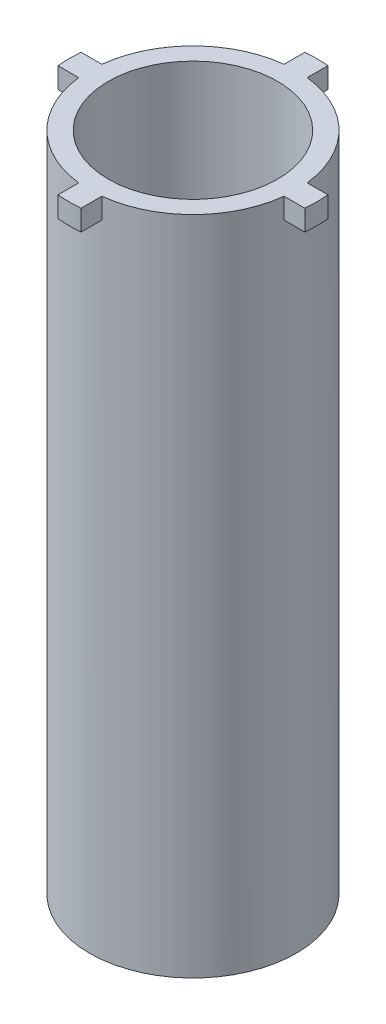
ISO-10303-21;
HEADER;
FILE_DESCRIPTION(('STEP AP214'),'2;1');
FILE_NAME('part.step','',(''),(''),'','','');
FILE_SCHEMA(('AUTOMOTIVE_DESIGN { 1 0 10303 214 1 1 1 1 }'));
ENDSEC;
DATA;
#1=APPLICATION_CONTEXT('core data for automotive mechanical design processes');
#2=APPLICATION_PROTOCOL_DEFINITION('international standard','automotive_design',2000,#1);
#3=PRODUCT_CONTEXT('',#1,'mechanical');
#4=PRODUCT('Part','Part','',(#3));
#5=PRODUCT_RELATED_PRODUCT_CATEGORY('part','',(#4));
#6=PRODUCT_DEFINITION_FORMATION('','',#4);
#7=PRODUCT_DEFINITION_CONTEXT('part definition',#1,'design');
#8=PRODUCT_DEFINITION('design','',#6,#7);
#9=PRODUCT_DEFINITION_SHAPE('','',#8);
#10=(LENGTH_UNIT() NAMED_UNIT(*) SI_UNIT(.MILLI.,.METRE.));
#11=(NAMED_UNIT(*) PLANE_ANGLE_UNIT() SI_UNIT($,.RADIAN.));
#12=(NAMED_UNIT(*) SI_UNIT($,.STERADIAN.) SOLID_ANGLE_UNIT());
#13=UNCERTAINTY_MEASURE_WITH_UNIT(LENGTH_MEASURE(1.E-05),#10,'distance_accuracy_value','');
#14=(GEOMETRIC_REPRESENTATION_CONTEXT(3) GLOBAL_UNCERTAINTY_ASSIGNED_CONTEXT((#13)) GLOBAL_UNIT_ASSIGNED_CONTEXT((#10,
#11,#12)) REPRESENTATION_CONTEXT('',''));
#15=CARTESIAN_POINT('',(0.,0.,0.));
#16=DIRECTION('',(0.,0.,1.));
#17=DIRECTION('',(1.,0.,0.));
#18=AXIS2_PLACEMENT_3D('',#15,#16,#17);
#19=CARTESIAN_POINT('',(0.,-80.,0.));
#20=DIRECTION('',(0.,1.,0.));
#21=DIRECTION('',(0.,0.,1.));
#22=AXIS2_PLACEMENT_3D('',#19,#20,#21);
#23=CYLINDRICAL_SURFACE('',#22,12.5);
#24=DIRECTION('',(0.,1.,0.));
#25=VECTOR('',#24,1.);
#26=CARTESIAN_POINT('',(1.4,-2.5,12.4213525833542));
#27=LINE('',#26,#25);
#28=CARTESIAN_POINT('',(1.4,-2.5,12.4213525833542));
#29=VERTEX_POINT('',#28);
#30=CARTESIAN_POINT('',(1.4,0.,12.4213525833542));
#31=VERTEX_POINT('',#30);
#32=EDGE_CURVE('E184',#29,#31,#27,.T.);
#33=ORIENTED_EDGE('',*,*,#32,.F.);
#34=CARTESIAN_POINT('',(0.,-2.5,0.));
#35=DIRECTION('',(0.,1.,0.));
#36=DIRECTION('',(0.,0.,1.));
#37=AXIS2_PLACEMENT_3D('',#34,#35,#36);
#38=CIRCLE('',#37,12.5);
#39=CARTESIAN_POINT('',(-1.4,-2.5,12.4213525833542));
#40=VERTEX_POINT('',#39);
#41=EDGE_CURVE('E163',#40,#29,#38,.T.);
#42=ORIENTED_EDGE('',*,*,#41,.F.);
#43=DIRECTION('',(0.,1.,0.));
#44=VECTOR('',#43,1.);
#45=CARTESIAN_POINT('',(-1.4,-2.5,12.4213525833542));
#46=LINE('',#45,#44);
#47=CARTESIAN_POINT('',(-1.4,0.,12.4213525833542));
#48=VERTEX_POINT('',#47);
#49=EDGE_CURVE('E171',#40,#48,#46,.T.);
#50=ORIENTED_EDGE('',*,*,#49,.T.);
#51=CARTESIAN_POINT('',(0.,0.,0.));
#52=DIRECTION('',(0.,1.,0.));
#53=DIRECTION('',(0.,0.,1.));
#54=AXIS2_PLACEMENT_3D('',#51,#52,#53);
#55=CIRCLE('',#54,12.5);
#56=CARTESIAN_POINT('',(-12.4213525833542,0.,1.4));
#57=VERTEX_POINT('',#56);
#58=EDGE_CURVE('E299',#57,#48,#55,.T.);
#59=ORIENTED_EDGE('',*,*,#58,.F.);
#60=DIRECTION('',(0.,1.,0.));
#61=VECTOR('',#60,1.);
#62=CARTESIAN_POINT('',(-12.4213525833542,-2.5,1.4));
#63=LINE('',#62,#61);
#64=CARTESIAN_POINT('',(-12.4213525833542,-2.5,1.4));
#65=VERTEX_POINT('',#64);
#66=EDGE_CURVE('E229',#65,#57,#63,.T.);
#67=ORIENTED_EDGE('',*,*,#66,.F.);
#68=CARTESIAN_POINT('',(0.,-2.5,0.));
#69=DIRECTION('',(0.,1.,0.));
#70=DIRECTION('',(0.,0.,1.));
#71=AXIS2_PLACEMENT_3D('',#68,#69,#70);
#72=CIRCLE('',#71,12.5);
#73=CARTESIAN_POINT('',(-12.4213525833542,-2.5,-1.4));
#74=VERTEX_POINT('',#73);
#75=EDGE_CURVE('E207',#74,#65,#72,.T.);
#76=ORIENTED_EDGE('',*,*,#75,.F.);
#77=DIRECTION('',(0.,1.,0.));
#78=VECTOR('',#77,1.);
#79=CARTESIAN_POINT('',(-12.4213525833542,-2.5,-1.4));
#80=LINE('',#79,#78);
#81=CARTESIAN_POINT('',(-12.4213525833542,0.,-1.4));
#82=VERTEX_POINT('',#81);
#83=EDGE_CURVE('E221',#74,#82,#80,.T.);
#84=ORIENTED_EDGE('',*,*,#83,.T.);
#85=CARTESIAN_POINT('',(-1.4,0.,-12.4213525833542));
#86=VERTEX_POINT('',#85);
#87=EDGE_CURVE('E287',#86,#82,#55,.T.);
#88=ORIENTED_EDGE('',*,*,#87,.F.);
#89=DIRECTION('',(0.,1.,0.));
#90=VECTOR('',#89,1.);
#91=CARTESIAN_POINT('',(-1.4,-2.5,-12.4213525833542));
#92=LINE('',#91,#90);
#93=CARTESIAN_POINT('',(-1.4,-2.5,-12.4213525833542));
#94=VERTEX_POINT('',#93);
#95=EDGE_CURVE('E11',#94,#86,#92,.T.);
#96=ORIENTED_EDGE('',*,*,#95,.F.);
#97=CARTESIAN_POINT('',(0.,-2.5,0.));
#98=DIRECTION('',(0.,1.,0.));
#99=DIRECTION('',(0.,0.,1.));
#100=AXIS2_PLACEMENT_3D('',#97,#98,#99);
#101=CIRCLE('',#100,12.5);
#102=CARTESIAN_POINT('',(1.4,-2.5,-12.4213525833542));
#103=VERTEX_POINT('',#102);
#104=EDGE_CURVE('E301',#103,#94,#101,.T.);
#105=ORIENTED_EDGE('',*,*,#104,.F.);
#106=DIRECTION('',(0.,1.,0.));
#107=VECTOR('',#106,1.);
#108=CARTESIAN_POINT('',(1.4,-2.5,-12.4213525833542));
#109=LINE('',#108,#107);
#110=CARTESIAN_POINT('',(1.4,0.,-12.4213525833542));
#111=VERTEX_POINT('',#110);
#112=EDGE_CURVE('E45',#103,#111,#109,.T.);
#113=ORIENTED_EDGE('',*,*,#112,.T.);
#114=CARTESIAN_POINT('',(12.4213525833542,0.,-1.4));
#115=VERTEX_POINT('',#114);
#116=EDGE_CURVE('E295',#115,#111,#55,.T.);
#117=ORIENTED_EDGE('',*,*,#116,.F.);
#118=DIRECTION('',(0.,1.,0.));
#119=VECTOR('',#118,1.);
#120=CARTESIAN_POINT('',(12.4213525833542,-2.5,-1.4));
#121=LINE('',#120,#119);
#122=CARTESIAN_POINT('',(12.4213525833542,-2.5,-1.4));
#123=VERTEX_POINT('',#122);
#124=EDGE_CURVE('E269',#123,#115,#121,.T.);
#125=ORIENTED_EDGE('',*,*,#124,.F.);
#126=CARTESIAN_POINT('',(0.,-2.5,0.));
#127=DIRECTION('',(0.,1.,0.));
#128=DIRECTION('',(0.,0.,1.));
#129=AXIS2_PLACEMENT_3D('',#126,#127,#128);
#130=CIRCLE('',#129,12.5);
#131=CARTESIAN_POINT('',(12.4213525833542,-2.5,1.4));
#132=VERTEX_POINT('',#131);
#133=EDGE_CURVE('E242',#132,#123,#130,.T.);
#134=ORIENTED_EDGE('',*,*,#133,.F.);
#135=DIRECTION('',(0.,1.,0.));
#136=VECTOR('',#135,1.);
#137=CARTESIAN_POINT('',(12.4213525833542,-2.5,1.4));
#138=LINE('',#137,#136);
#139=CARTESIAN_POINT('',(12.4213525833542,0.,1.4));
#140=VERTEX_POINT('',#139);
#141=EDGE_CURVE('E258',#132,#140,#138,.T.);
#142=ORIENTED_EDGE('',*,*,#141,.T.);
#143=EDGE_CURVE('E300',#31,#140,#55,.T.);
#144=ORIENTED_EDGE('',*,*,#143,.F.);
#145=EDGE_LOOP('',(#33,#42,#50,#59,#67,#76,#84,#88,#96,#105,#113,#117,#125,#134,#142,#144));
#146=FACE_BOUND('',#145,.T.);
#147=CARTESIAN_POINT('',(0.,-80.,0.));
#148=DIRECTION('',(0.,1.,0.));
#149=DIRECTION('',(0.,0.,1.));
#150=AXIS2_PLACEMENT_3D('',#147,#148,#149);
#151=CIRCLE('',#150,12.5);
#152=CARTESIAN_POINT('',(0.,-80.,12.5));
#153=VERTEX_POINT('',#152);
#154=EDGE_CURVE('E286',#153,#153,#151,.T.);
#155=ORIENTED_EDGE('',*,*,#154,.T.);
#156=EDGE_LOOP('',(#155));
#157=FACE_BOUND('',#156,.T.);
#158=ADVANCED_FACE('F41',(#146,#157),#23,.T.);
#159=CARTESIAN_POINT('',(-1.4,-2.5,0.));
#160=DIRECTION('',(1.,0.,0.));
#161=DIRECTION('',(0.,0.,-1.));
#162=AXIS2_PLACEMENT_3D('',#159,#160,#161);
#163=PLANE('',#162);
#164=DIRECTION('',(0.,0.,-1.));
#165=VECTOR('',#164,1.);
#166=CARTESIAN_POINT('',(-1.4,0.,0.));
#167=LINE('',#166,#165);
#168=CARTESIAN_POINT('',(-1.4,0.,-14.9345237620756));
#169=VERTEX_POINT('',#168);
#170=EDGE_CURVE('E306',#86,#169,#167,.T.);
#171=ORIENTED_EDGE('',*,*,#170,.T.);
#172=DIRECTION('',(0.,1.,0.));
#173=VECTOR('',#172,1.);
#174=CARTESIAN_POINT('',(-1.4,-2.5,-14.9345237620756));
#175=LINE('',#174,#173);
#176=CARTESIAN_POINT('',(-1.4,-2.5,-14.9345237620756));
#177=VERTEX_POINT('',#176);
#178=EDGE_CURVE('E51',#177,#169,#175,.T.);
#179=ORIENTED_EDGE('',*,*,#178,.F.);
#180=DIRECTION('',(0.,0.,-1.));
#181=VECTOR('',#180,1.);
#182=CARTESIAN_POINT('',(-1.4,-2.5,0.));
#183=LINE('',#182,#181);
#184=EDGE_CURVE('E314',#94,#177,#183,.T.);
#185=ORIENTED_EDGE('',*,*,#184,.F.);
#186=ORIENTED_EDGE('',*,*,#95,.T.);
#187=EDGE_LOOP('',(#171,#179,#185,#186));
#188=FACE_BOUND('',#187,.T.);
#189=ADVANCED_FACE('F370',(#188),#163,.F.);
#190=CARTESIAN_POINT('',(0.,-2.5,0.));
#191=DIRECTION('',(0.,1.,0.));
#192=DIRECTION('',(0.,0.,1.));
#193=AXIS2_PLACEMENT_3D('',#190,#191,#192);
#194=CYLINDRICAL_SURFACE('',#193,15.);
#195=CARTESIAN_POINT('',(0.,0.,0.));
#196=DIRECTION('',(0.,1.,0.));
#197=DIRECTION('',(0.,0.,1.));
#198=AXIS2_PLACEMENT_3D('',#195,#196,#197);
#199=CIRCLE('',#198,15.);
#200=CARTESIAN_POINT('',(1.4,0.,-14.9345237620756));
#201=VERTEX_POINT('',#200);
#202=EDGE_CURVE('E320',#201,#169,#199,.T.);
#203=ORIENTED_EDGE('',*,*,#202,.F.);
#204=DIRECTION('',(0.,1.,0.));
#205=VECTOR('',#204,1.);
#206=CARTESIAN_POINT('',(1.4,-2.5,-14.9345237620756));
#207=LINE('',#206,#205);
#208=CARTESIAN_POINT('',(1.4,-2.5,-14.9345237620756));
#209=VERTEX_POINT('',#208);
#210=EDGE_CURVE('E328',#209,#201,#207,.T.);
#211=ORIENTED_EDGE('',*,*,#210,.F.);
#212=CARTESIAN_POINT('',(0.,-2.5,0.));
#213=DIRECTION('',(0.,1.,0.));
#214=DIRECTION('',(0.,0.,1.));
#215=AXIS2_PLACEMENT_3D('',#212,#213,#214);
#216=CIRCLE('',#215,15.);
#217=EDGE_CURVE('E310',#209,#177,#216,.T.);
#218=ORIENTED_EDGE('',*,*,#217,.T.);
#219=ORIENTED_EDGE('',*,*,#178,.T.);
#220=EDGE_LOOP('',(#203,#211,#218,#219));
#221=FACE_BOUND('',#220,.T.);
#222=ADVANCED_FACE('F345',(#221),#194,.T.);
#223=CARTESIAN_POINT('',(1.4,-2.5,0.));
#224=DIRECTION('',(1.,0.,0.));
#225=DIRECTION('',(0.,0.,-1.));
#226=AXIS2_PLACEMENT_3D('',#223,#224,#225);
#227=PLANE('',#226);
#228=DIRECTION('',(0.,0.,-1.));
#229=VECTOR('',#228,1.);
#230=CARTESIAN_POINT('',(1.4,0.,0.));
#231=LINE('',#230,#229);
#232=EDGE_CURVE('E291',#111,#201,#231,.T.);
#233=ORIENTED_EDGE('',*,*,#232,.F.);
#234=ORIENTED_EDGE('',*,*,#112,.F.);
#235=DIRECTION('',(0.,0.,-1.));
#236=VECTOR('',#235,1.);
#237=CARTESIAN_POINT('',(1.4,-2.5,0.));
#238=LINE('',#237,#236);
#239=EDGE_CURVE('E305',#103,#209,#238,.T.);
#240=ORIENTED_EDGE('',*,*,#239,.T.);
#241=ORIENTED_EDGE('',*,*,#210,.T.);
#242=EDGE_LOOP('',(#233,#234,#240,#241));
#243=FACE_BOUND('',#242,.T.);
#244=ADVANCED_FACE('F43',(#243),#227,.T.);
#245=CARTESIAN_POINT('',(0.,-2.5,0.));
#246=DIRECTION('',(0.,1.,0.));
#247=DIRECTION('',(0.,0.,1.));
#248=AXIS2_PLACEMENT_3D('',#245,#246,#247);
#249=PLANE('',#248);
#250=ORIENTED_EDGE('',*,*,#104,.T.);
#251=ORIENTED_EDGE('',*,*,#184,.T.);
#252=ORIENTED_EDGE('',*,*,#217,.F.);
#253=ORIENTED_EDGE('',*,*,#239,.F.);
#254=EDGE_LOOP('',(#250,#251,#252,#253));
#255=FACE_BOUND('',#254,.T.);
#256=ADVANCED_FACE('F342',(#255),#249,.F.);
#257=CARTESIAN_POINT('',(0.,0.,0.));
#258=DIRECTION('',(0.,1.,0.));
#259=DIRECTION('',(0.,0.,1.));
#260=AXIS2_PLACEMENT_3D('',#257,#258,#259);
#261=PLANE('',#260);
#262=ORIENTED_EDGE('',*,*,#170,.F.);
#263=ORIENTED_EDGE('',*,*,#87,.T.);
#264=DIRECTION('',(1.,0.,0.));
#265=VECTOR('',#264,1.);
#266=CARTESIAN_POINT('',(0.,0.,-1.4));
#267=LINE('',#266,#265);
#268=CARTESIAN_POINT('',(-14.9345237620756,0.,-1.4));
#269=VERTEX_POINT('',#268);
#270=EDGE_CURVE('E201',#269,#82,#267,.T.);
#271=ORIENTED_EDGE('',*,*,#270,.F.);
#272=CARTESIAN_POINT('',(0.,0.,0.));
#273=DIRECTION('',(0.,1.,0.));
#274=DIRECTION('',(0.,0.,1.));
#275=AXIS2_PLACEMENT_3D('',#272,#273,#274);
#276=CIRCLE('',#275,15.);
#277=CARTESIAN_POINT('',(-14.9345237620756,0.,1.4));
#278=VERTEX_POINT('',#277);
#279=EDGE_CURVE('E224',#269,#278,#276,.T.);
#280=ORIENTED_EDGE('',*,*,#279,.T.);
#281=DIRECTION('',(1.,0.,0.));
#282=VECTOR('',#281,1.);
#283=CARTESIAN_POINT('',(0.,0.,1.4));
#284=LINE('',#283,#282);
#285=EDGE_CURVE('E66',#278,#57,#284,.T.);
#286=ORIENTED_EDGE('',*,*,#285,.T.);
#287=ORIENTED_EDGE('',*,*,#58,.T.);
#288=DIRECTION('',(0.,0.,-1.));
#289=VECTOR('',#288,1.);
#290=CARTESIAN_POINT('',(-1.4,0.,0.));
#291=LINE('',#290,#289);
#292=CARTESIAN_POINT('',(-1.4,0.,14.9345237620756));
#293=VERTEX_POINT('',#292);
#294=EDGE_CURVE('E174',#293,#48,#291,.T.);
#295=ORIENTED_EDGE('',*,*,#294,.F.);
#296=CARTESIAN_POINT('',(0.,0.,0.));
#297=DIRECTION('',(0.,1.,0.));
#298=DIRECTION('',(0.,0.,1.));
#299=AXIS2_PLACEMENT_3D('',#296,#297,#298);
#300=CIRCLE('',#299,15.);
#301=CARTESIAN_POINT('',(1.4,0.,14.9345237620756));
#302=VERTEX_POINT('',#301);
#303=EDGE_CURVE('E188',#293,#302,#300,.T.);
#304=ORIENTED_EDGE('',*,*,#303,.T.);
#305=DIRECTION('',(0.,0.,-1.));
#306=VECTOR('',#305,1.);
#307=CARTESIAN_POINT('',(1.4,0.,0.));
#308=LINE('',#307,#306);
#309=EDGE_CURVE('E59',#302,#31,#308,.T.);
#310=ORIENTED_EDGE('',*,*,#309,.T.);
#311=ORIENTED_EDGE('',*,*,#143,.T.);
#312=DIRECTION('',(1.,0.,0.));
#313=VECTOR('',#312,1.);
#314=CARTESIAN_POINT('',(0.,0.,1.4));
#315=LINE('',#314,#313);
#316=CARTESIAN_POINT('',(14.9345237620756,0.,1.4));
#317=VERTEX_POINT('',#316);
#318=EDGE_CURVE('E232',#140,#317,#315,.T.);
#319=ORIENTED_EDGE('',*,*,#318,.T.);
#320=CARTESIAN_POINT('',(0.,0.,0.));
#321=DIRECTION('',(0.,1.,0.));
#322=DIRECTION('',(0.,0.,1.));
#323=AXIS2_PLACEMENT_3D('',#320,#321,#322);
#324=CIRCLE('',#323,15.);
#325=CARTESIAN_POINT('',(14.9345237620756,0.,-1.4));
#326=VERTEX_POINT('',#325);
#327=EDGE_CURVE('E262',#317,#326,#324,.T.);
#328=ORIENTED_EDGE('',*,*,#327,.T.);
#329=DIRECTION('',(1.,0.,0.));
#330=VECTOR('',#329,1.);
#331=CARTESIAN_POINT('',(0.,0.,-1.4));
#332=LINE('',#331,#330);
#333=EDGE_CURVE('E247',#115,#326,#332,.T.);
#334=ORIENTED_EDGE('',*,*,#333,.F.);
#335=ORIENTED_EDGE('',*,*,#116,.T.);
#336=ORIENTED_EDGE('',*,*,#232,.T.);
#337=ORIENTED_EDGE('',*,*,#202,.T.);
#338=EDGE_LOOP('',(#262,#263,#271,#280,#286,#287,#295,#304,#310,#311,#319,#328,#334,#335,#336,#337));
#339=FACE_BOUND('',#338,.T.);
#340=CARTESIAN_POINT('',(0.,0.,0.));
#341=DIRECTION('',(0.,1.,0.));
#342=DIRECTION('',(0.,0.,1.));
#343=AXIS2_PLACEMENT_3D('',#340,#341,#342);
#344=CIRCLE('',#343,10.25);
#345=CARTESIAN_POINT('',(0.,0.,10.25));
#346=VERTEX_POINT('',#345);
#347=EDGE_CURVE('E272',#346,#346,#344,.T.);
#348=ORIENTED_EDGE('',*,*,#347,.F.);
#349=EDGE_LOOP('',(#348));
#350=FACE_BOUND('',#349,.T.);
#351=ADVANCED_FACE('F347',(#339,#350),#261,.T.);
#352=CARTESIAN_POINT('',(0.,-80.,0.));
#353=DIRECTION('',(0.,1.,0.));
#354=DIRECTION('',(0.,0.,1.));
#355=AXIS2_PLACEMENT_3D('',#352,#353,#354);
#356=CYLINDRICAL_SURFACE('',#355,10.25);
#357=CARTESIAN_POINT('',(0.,-80.,0.));
#358=DIRECTION('',(0.,1.,0.));
#359=DIRECTION('',(0.,0.,1.));
#360=AXIS2_PLACEMENT_3D('',#357,#358,#359);
#361=CIRCLE('',#360,10.25);
#362=CARTESIAN_POINT('',(0.,-80.,10.25));
#363=VERTEX_POINT('',#362);
#364=EDGE_CURVE('E282',#363,#363,#361,.T.);
#365=ORIENTED_EDGE('',*,*,#364,.F.);
#366=EDGE_LOOP('',(#365));
#367=FACE_BOUND('',#366,.T.);
#368=ORIENTED_EDGE('',*,*,#347,.T.);
#369=EDGE_LOOP('',(#368));
#370=FACE_BOUND('',#369,.T.);
#371=ADVANCED_FACE('F381',(#367,#370),#356,.F.);
#372=CARTESIAN_POINT('',(0.,-80.,0.));
#373=DIRECTION('',(0.,1.,0.));
#374=DIRECTION('',(0.,0.,1.));
#375=AXIS2_PLACEMENT_3D('',#372,#373,#374);
#376=PLANE('',#375);
#377=ORIENTED_EDGE('',*,*,#364,.T.);
#378=EDGE_LOOP('',(#377));
#379=FACE_BOUND('',#378,.T.);
#380=ORIENTED_EDGE('',*,*,#154,.F.);
#381=EDGE_LOOP('',(#380));
#382=FACE_BOUND('',#381,.T.);
#383=ADVANCED_FACE('F385',(#379,#382),#376,.F.);
#384=CARTESIAN_POINT('',(0.,-2.5,-1.4));
#385=DIRECTION('',(0.,0.,1.));
#386=DIRECTION('',(1.,0.,0.));
#387=AXIS2_PLACEMENT_3D('',#384,#385,#386);
#388=PLANE('',#387);
#389=ORIENTED_EDGE('',*,*,#333,.T.);
#390=DIRECTION('',(0.,1.,0.));
#391=VECTOR('',#390,1.);
#392=CARTESIAN_POINT('',(14.9345237620756,-2.5,-1.4));
#393=LINE('',#392,#391);
#394=CARTESIAN_POINT('',(14.9345237620756,-2.5,-1.4));
#395=VERTEX_POINT('',#394);
#396=EDGE_CURVE('E273',#395,#326,#393,.T.);
#397=ORIENTED_EDGE('',*,*,#396,.F.);
#398=DIRECTION('',(1.,0.,0.));
#399=VECTOR('',#398,1.);
#400=CARTESIAN_POINT('',(0.,-2.5,-1.4));
#401=LINE('',#400,#399);
#402=EDGE_CURVE('E255',#123,#395,#401,.T.);
#403=ORIENTED_EDGE('',*,*,#402,.F.);
#404=ORIENTED_EDGE('',*,*,#124,.T.);
#405=EDGE_LOOP('',(#389,#397,#403,#404));
#406=FACE_BOUND('',#405,.T.);
#407=ADVANCED_FACE('F390',(#406),#388,.F.);
#408=CARTESIAN_POINT('',(0.,-2.5,0.));
#409=DIRECTION('',(0.,1.,0.));
#410=DIRECTION('',(0.,0.,1.));
#411=AXIS2_PLACEMENT_3D('',#408,#409,#410);
#412=CYLINDRICAL_SURFACE('',#411,15.);
#413=ORIENTED_EDGE('',*,*,#327,.F.);
#414=DIRECTION('',(0.,1.,0.));
#415=VECTOR('',#414,1.);
#416=CARTESIAN_POINT('',(14.9345237620756,-2.5,1.4));
#417=LINE('',#416,#415);
#418=CARTESIAN_POINT('',(14.9345237620756,-2.5,1.4));
#419=VERTEX_POINT('',#418);
#420=EDGE_CURVE('E276',#419,#317,#417,.T.);
#421=ORIENTED_EDGE('',*,*,#420,.F.);
#422=CARTESIAN_POINT('',(0.,-2.5,0.));
#423=DIRECTION('',(0.,1.,0.));
#424=DIRECTION('',(0.,0.,1.));
#425=AXIS2_PLACEMENT_3D('',#422,#423,#424);
#426=CIRCLE('',#425,15.);
#427=EDGE_CURVE('E251',#419,#395,#426,.T.);
#428=ORIENTED_EDGE('',*,*,#427,.T.);
#429=ORIENTED_EDGE('',*,*,#396,.T.);
#430=EDGE_LOOP('',(#413,#421,#428,#429));
#431=FACE_BOUND('',#430,.T.);
#432=ADVANCED_FACE('F396',(#431),#412,.T.);
#433=CARTESIAN_POINT('',(0.,-2.5,1.4));
#434=DIRECTION('',(0.,0.,1.));
#435=DIRECTION('',(1.,0.,0.));
#436=AXIS2_PLACEMENT_3D('',#433,#434,#435);
#437=PLANE('',#436);
#438=ORIENTED_EDGE('',*,*,#318,.F.);
#439=ORIENTED_EDGE('',*,*,#141,.F.);
#440=DIRECTION('',(1.,0.,0.));
#441=VECTOR('',#440,1.);
#442=CARTESIAN_POINT('',(0.,-2.5,1.4));
#443=LINE('',#442,#441);
#444=EDGE_CURVE('E246',#132,#419,#443,.T.);
#445=ORIENTED_EDGE('',*,*,#444,.T.);
#446=ORIENTED_EDGE('',*,*,#420,.T.);
#447=EDGE_LOOP('',(#438,#439,#445,#446));
#448=FACE_BOUND('',#447,.T.);
#449=ADVANCED_FACE('F392',(#448),#437,.T.);
#450=CARTESIAN_POINT('',(0.,-2.5,0.));
#451=DIRECTION('',(0.,1.,0.));
#452=DIRECTION('',(0.,0.,1.));
#453=AXIS2_PLACEMENT_3D('',#450,#451,#452);
#454=PLANE('',#453);
#455=ORIENTED_EDGE('',*,*,#133,.T.);
#456=ORIENTED_EDGE('',*,*,#402,.T.);
#457=ORIENTED_EDGE('',*,*,#427,.F.);
#458=ORIENTED_EDGE('',*,*,#444,.F.);
#459=EDGE_LOOP('',(#455,#456,#457,#458));
#460=FACE_BOUND('',#459,.T.);
#461=ADVANCED_FACE('F395',(#460),#454,.F.);
#462=CARTESIAN_POINT('',(0.,-2.5,1.4));
#463=DIRECTION('',(0.,0.,1.));
#464=DIRECTION('',(1.,0.,0.));
#465=AXIS2_PLACEMENT_3D('',#462,#463,#464);
#466=PLANE('',#465);
#467=ORIENTED_EDGE('',*,*,#285,.F.);
#468=DIRECTION('',(0.,1.,0.));
#469=VECTOR('',#468,1.);
#470=CARTESIAN_POINT('',(-14.9345237620756,-2.5,1.4));
#471=LINE('',#470,#469);
#472=CARTESIAN_POINT('',(-14.9345237620756,-2.5,1.4));
#473=VERTEX_POINT('',#472);
#474=EDGE_CURVE('E233',#473,#278,#471,.T.);
#475=ORIENTED_EDGE('',*,*,#474,.F.);
#476=DIRECTION('',(1.,0.,0.));
#477=VECTOR('',#476,1.);
#478=CARTESIAN_POINT('',(0.,-2.5,1.4));
#479=LINE('',#478,#477);
#480=EDGE_CURVE('E217',#473,#65,#479,.T.);
#481=ORIENTED_EDGE('',*,*,#480,.T.);
#482=ORIENTED_EDGE('',*,*,#66,.T.);
#483=EDGE_LOOP('',(#467,#475,#481,#482));
#484=FACE_BOUND('',#483,.T.);
#485=ADVANCED_FACE('F357',(#484),#466,.T.);
#486=CARTESIAN_POINT('',(0.,-2.5,0.));
#487=DIRECTION('',(0.,1.,0.));
#488=DIRECTION('',(0.,0.,1.));
#489=AXIS2_PLACEMENT_3D('',#486,#487,#488);
#490=CYLINDRICAL_SURFACE('',#489,15.);
#491=ORIENTED_EDGE('',*,*,#279,.F.);
#492=DIRECTION('',(0.,1.,0.));
#493=VECTOR('',#492,1.);
#494=CARTESIAN_POINT('',(-14.9345237620756,-2.5,-1.4));
#495=LINE('',#494,#493);
#496=CARTESIAN_POINT('',(-14.9345237620756,-2.5,-1.4));
#497=VERTEX_POINT('',#496);
#498=EDGE_CURVE('E236',#497,#269,#495,.T.);
#499=ORIENTED_EDGE('',*,*,#498,.F.);
#500=CARTESIAN_POINT('',(0.,-2.5,0.));
#501=DIRECTION('',(0.,1.,0.));
#502=DIRECTION('',(0.,0.,1.));
#503=AXIS2_PLACEMENT_3D('',#500,#501,#502);
#504=CIRCLE('',#503,15.);
#505=EDGE_CURVE('E213',#497,#473,#504,.T.);
#506=ORIENTED_EDGE('',*,*,#505,.T.);
#507=ORIENTED_EDGE('',*,*,#474,.T.);
#508=EDGE_LOOP('',(#491,#499,#506,#507));
#509=FACE_BOUND('',#508,.T.);
#510=ADVANCED_FACE('F409',(#509),#490,.T.);
#511=CARTESIAN_POINT('',(0.,-2.5,-1.4));
#512=DIRECTION('',(0.,0.,1.));
#513=DIRECTION('',(1.,0.,0.));
#514=AXIS2_PLACEMENT_3D('',#511,#512,#513);
#515=PLANE('',#514);
#516=ORIENTED_EDGE('',*,*,#270,.T.);
#517=ORIENTED_EDGE('',*,*,#83,.F.);
#518=DIRECTION('',(1.,0.,0.));
#519=VECTOR('',#518,1.);
#520=CARTESIAN_POINT('',(0.,-2.5,-1.4));
#521=LINE('',#520,#519);
#522=EDGE_CURVE('E210',#497,#74,#521,.T.);
#523=ORIENTED_EDGE('',*,*,#522,.F.);
#524=ORIENTED_EDGE('',*,*,#498,.T.);
#525=EDGE_LOOP('',(#516,#517,#523,#524));
#526=FACE_BOUND('',#525,.T.);
#527=ADVANCED_FACE('F365',(#526),#515,.F.);
#528=CARTESIAN_POINT('',(0.,-2.5,0.));
#529=DIRECTION('',(0.,1.,0.));
#530=DIRECTION('',(0.,0.,1.));
#531=AXIS2_PLACEMENT_3D('',#528,#529,#530);
#532=PLANE('',#531);
#533=ORIENTED_EDGE('',*,*,#75,.T.);
#534=ORIENTED_EDGE('',*,*,#480,.F.);
#535=ORIENTED_EDGE('',*,*,#505,.F.);
#536=ORIENTED_EDGE('',*,*,#522,.T.);
#537=EDGE_LOOP('',(#533,#534,#535,#536));
#538=FACE_BOUND('',#537,.T.);
#539=ADVANCED_FACE('F361',(#538),#532,.F.);
#540=CARTESIAN_POINT('',(1.4,-2.5,0.));
#541=DIRECTION('',(1.,0.,0.));
#542=DIRECTION('',(0.,0.,-1.));
#543=AXIS2_PLACEMENT_3D('',#540,#541,#542);
#544=PLANE('',#543);
#545=ORIENTED_EDGE('',*,*,#309,.F.);
#546=DIRECTION('',(0.,1.,0.));
#547=VECTOR('',#546,1.);
#548=CARTESIAN_POINT('',(1.4,-2.5,14.9345237620756));
#549=LINE('',#548,#547);
#550=CARTESIAN_POINT('',(1.4,-2.5,14.9345237620756));
#551=VERTEX_POINT('',#550);
#552=EDGE_CURVE('E202',#551,#302,#549,.T.);
#553=ORIENTED_EDGE('',*,*,#552,.F.);
#554=DIRECTION('',(0.,0.,-1.));
#555=VECTOR('',#554,1.);
#556=CARTESIAN_POINT('',(1.4,-2.5,0.));
#557=LINE('',#556,#555);
#558=EDGE_CURVE('E179',#551,#29,#557,.T.);
#559=ORIENTED_EDGE('',*,*,#558,.T.);
#560=ORIENTED_EDGE('',*,*,#32,.T.);
#561=EDGE_LOOP('',(#545,#553,#559,#560));
#562=FACE_BOUND('',#561,.T.);
#563=ADVANCED_FACE('F417',(#562),#544,.T.);
#564=CARTESIAN_POINT('',(0.,-2.5,0.));
#565=DIRECTION('',(0.,1.,0.));
#566=DIRECTION('',(0.,0.,1.));
#567=AXIS2_PLACEMENT_3D('',#564,#565,#566);
#568=CYLINDRICAL_SURFACE('',#567,15.);
#569=ORIENTED_EDGE('',*,*,#303,.F.);
#570=DIRECTION('',(0.,1.,0.));
#571=VECTOR('',#570,1.);
#572=CARTESIAN_POINT('',(-1.4,-2.5,14.9345237620756));
#573=LINE('',#572,#571);
#574=CARTESIAN_POINT('',(-1.4,-2.5,14.9345237620756));
#575=VERTEX_POINT('',#574);
#576=EDGE_CURVE('E178',#575,#293,#573,.T.);
#577=ORIENTED_EDGE('',*,*,#576,.F.);
#578=CARTESIAN_POINT('',(0.,-2.5,0.));
#579=DIRECTION('',(0.,1.,0.));
#580=DIRECTION('',(0.,0.,1.));
#581=AXIS2_PLACEMENT_3D('',#578,#579,#580);
#582=CIRCLE('',#581,15.);
#583=EDGE_CURVE('E166',#575,#551,#582,.T.);
#584=ORIENTED_EDGE('',*,*,#583,.T.);
#585=ORIENTED_EDGE('',*,*,#552,.T.);
#586=EDGE_LOOP('',(#569,#577,#584,#585));
#587=FACE_BOUND('',#586,.T.);
#588=ADVANCED_FACE('F420',(#587),#568,.T.);
#589=CARTESIAN_POINT('',(-1.4,-2.5,0.));
#590=DIRECTION('',(1.,0.,0.));
#591=DIRECTION('',(0.,0.,-1.));
#592=AXIS2_PLACEMENT_3D('',#589,#590,#591);
#593=PLANE('',#592);
#594=ORIENTED_EDGE('',*,*,#294,.T.);
#595=ORIENTED_EDGE('',*,*,#49,.F.);
#596=DIRECTION('',(0.,0.,-1.));
#597=VECTOR('',#596,1.);
#598=CARTESIAN_POINT('',(-1.4,-2.5,0.));
#599=LINE('',#598,#597);
#600=EDGE_CURVE('E158',#575,#40,#599,.T.);
#601=ORIENTED_EDGE('',*,*,#600,.F.);
#602=ORIENTED_EDGE('',*,*,#576,.T.);
#603=EDGE_LOOP('',(#594,#595,#601,#602));
#604=FACE_BOUND('',#603,.T.);
#605=ADVANCED_FACE('F172',(#604),#593,.F.);
#606=CARTESIAN_POINT('',(0.,-2.5,0.));
#607=DIRECTION('',(0.,1.,0.));
#608=DIRECTION('',(0.,0.,1.));
#609=AXIS2_PLACEMENT_3D('',#606,#607,#608);
#610=PLANE('',#609);
#611=ORIENTED_EDGE('',*,*,#41,.T.);
#612=ORIENTED_EDGE('',*,*,#558,.F.);
#613=ORIENTED_EDGE('',*,*,#583,.F.);
#614=ORIENTED_EDGE('',*,*,#600,.T.);
#615=EDGE_LOOP('',(#611,#612,#613,#614));
#616=FACE_BOUND('',#615,.T.);
#617=ADVANCED_FACE('F160',(#616),#610,.F.);
#618=CLOSED_SHELL('',(#158,#189,#222,#244,#256,#351,#371,#383,#407,#432,#449,#461,#485,#510,
#527,#539,#563,#588,#605,#617));
#619=MANIFOLD_SOLID_BREP('B2',#618);
#620=ADVANCED_BREP_SHAPE_REPRESENTATION('',(#18,#619),#14);
#621=SHAPE_DEFINITION_REPRESENTATION(#9,#620);
ENDSEC;
END-ISO-10303-21;
